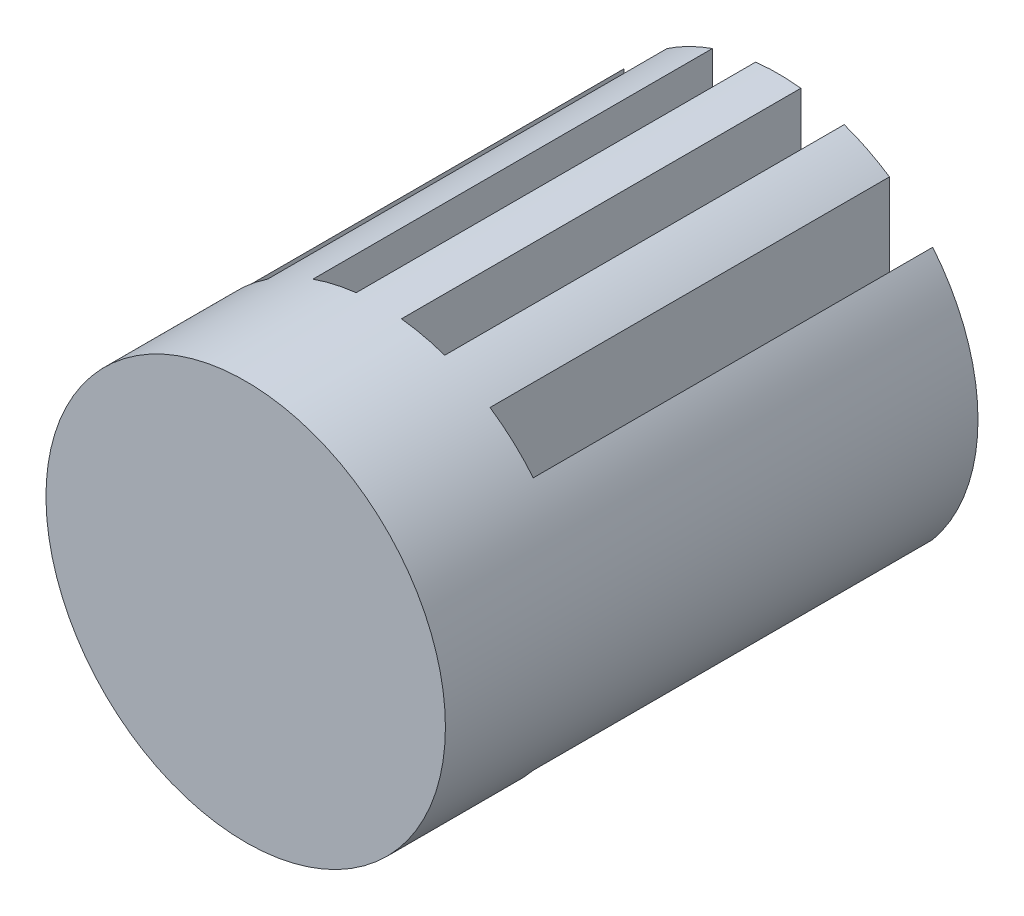
ISO-10303-21;
HEADER;
FILE_DESCRIPTION(('STEP AP214'),'2;1');
FILE_NAME('part.step','',(''),(''),'','','');
FILE_SCHEMA(('AUTOMOTIVE_DESIGN { 1 0 10303 214 1 1 1 1 }'));
ENDSEC;
DATA;
#1=APPLICATION_CONTEXT('core data for automotive mechanical design processes');
#2=APPLICATION_PROTOCOL_DEFINITION('international standard','automotive_design',2000,#1);
#3=PRODUCT_CONTEXT('',#1,'mechanical');
#4=PRODUCT('Part','Part','',(#3));
#5=PRODUCT_RELATED_PRODUCT_CATEGORY('part','',(#4));
#6=PRODUCT_DEFINITION_FORMATION('','',#4);
#7=PRODUCT_DEFINITION_CONTEXT('part definition',#1,'design');
#8=PRODUCT_DEFINITION('design','',#6,#7);
#9=PRODUCT_DEFINITION_SHAPE('','',#8);
#10=(LENGTH_UNIT() NAMED_UNIT(*) SI_UNIT(.MILLI.,.METRE.));
#11=(NAMED_UNIT(*) PLANE_ANGLE_UNIT() SI_UNIT($,.RADIAN.));
#12=(NAMED_UNIT(*) SI_UNIT($,.STERADIAN.) SOLID_ANGLE_UNIT());
#13=UNCERTAINTY_MEASURE_WITH_UNIT(LENGTH_MEASURE(1.E-05),#10,'distance_accuracy_value','');
#14=(GEOMETRIC_REPRESENTATION_CONTEXT(3) GLOBAL_UNCERTAINTY_ASSIGNED_CONTEXT((#13)) GLOBAL_UNIT_ASSIGNED_CONTEXT((#10,
#11,#12)) REPRESENTATION_CONTEXT('',''));
#15=CARTESIAN_POINT('',(0.,0.,0.));
#16=DIRECTION('',(0.,0.,1.));
#17=DIRECTION('',(1.,0.,0.));
#18=AXIS2_PLACEMENT_3D('',#15,#16,#17);
#19=CARTESIAN_POINT('',(0.,0.,0.));
#20=DIRECTION('',(0.,0.,1.));
#21=DIRECTION('',(1.,0.,0.));
#22=AXIS2_PLACEMENT_3D('',#19,#20,#21);
#23=PLANE('',#22);
#24=CARTESIAN_POINT('',(0.,0.,0.));
#25=DIRECTION('',(0.,0.,1.));
#26=DIRECTION('',(1.,0.,0.));
#27=AXIS2_PLACEMENT_3D('',#24,#25,#26);
#28=CIRCLE('',#27,19.05);
#29=CARTESIAN_POINT('',(10.6045,15.8255198887746,0.));
#30=VERTEX_POINT('',#29);
#31=CARTESIAN_POINT('',(6.2865,17.982836754806,0.));
#32=VERTEX_POINT('',#31);
#33=EDGE_CURVE('E319',#30,#32,#28,.T.);
#34=ORIENTED_EDGE('',*,*,#33,.F.);
#35=DIRECTION('',(0.,1.,0.));
#36=VECTOR('',#35,1.);
#37=CARTESIAN_POINT('',(10.6045,19.05,0.));
#38=LINE('',#37,#36);
#39=CARTESIAN_POINT('',(10.6045,-15.8255198887746,0.));
#40=VERTEX_POINT('',#39);
#41=EDGE_CURVE('E269',#40,#30,#38,.T.);
#42=ORIENTED_EDGE('',*,*,#41,.F.);
#43=CARTESIAN_POINT('',(6.28649999999999,-17.982836754806,0.));
#44=VERTEX_POINT('',#43);
#45=EDGE_CURVE('E187',#44,#40,#28,.T.);
#46=ORIENTED_EDGE('',*,*,#45,.F.);
#47=DIRECTION('',(0.,-1.,0.));
#48=VECTOR('',#47,1.);
#49=CARTESIAN_POINT('',(6.2865,19.05,0.));
#50=LINE('',#49,#48);
#51=EDGE_CURVE('E278',#32,#44,#50,.T.);
#52=ORIENTED_EDGE('',*,*,#51,.F.);
#53=EDGE_LOOP('',(#34,#42,#46,#52));
#54=FACE_BOUND('',#53,.T.);
#55=ADVANCED_FACE('F39',(#54),#23,.F.);
#56=CARTESIAN_POINT('',(2.159,18.9272612651699,0.));
#57=VERTEX_POINT('',#56);
#58=CARTESIAN_POINT('',(-2.159,18.9272612651699,0.));
#59=VERTEX_POINT('',#58);
#60=EDGE_CURVE('E192',#57,#59,#28,.T.);
#61=ORIENTED_EDGE('',*,*,#60,.F.);
#62=DIRECTION('',(0.,1.,0.));
#63=VECTOR('',#62,1.);
#64=CARTESIAN_POINT('',(2.159,19.05,0.));
#65=LINE('',#64,#63);
#66=CARTESIAN_POINT('',(2.159,-18.9272612651699,0.));
#67=VERTEX_POINT('',#66);
#68=EDGE_CURVE('E281',#67,#57,#65,.T.);
#69=ORIENTED_EDGE('',*,*,#68,.F.);
#70=CARTESIAN_POINT('',(-2.159,-18.9272612651699,0.));
#71=VERTEX_POINT('',#70);
#72=EDGE_CURVE('E186',#71,#67,#28,.T.);
#73=ORIENTED_EDGE('',*,*,#72,.F.);
#74=DIRECTION('',(0.,1.,0.));
#75=VECTOR('',#74,1.);
#76=CARTESIAN_POINT('',(-2.159,0.,0.));
#77=LINE('',#76,#75);
#78=EDGE_CURVE('E198',#71,#59,#77,.T.);
#79=ORIENTED_EDGE('',*,*,#78,.T.);
#80=EDGE_LOOP('',(#61,#69,#73,#79));
#81=FACE_BOUND('',#80,.T.);
#82=ADVANCED_FACE('F345',(#81),#23,.F.);
#83=CARTESIAN_POINT('',(-10.6045,-15.8255198887746,0.));
#84=VERTEX_POINT('',#83);
#85=CARTESIAN_POINT('',(-6.2865,-17.982836754806,0.));
#86=VERTEX_POINT('',#85);
#87=EDGE_CURVE('E180',#84,#86,#28,.T.);
#88=ORIENTED_EDGE('',*,*,#87,.F.);
#89=DIRECTION('',(0.,1.,0.));
#90=VECTOR('',#89,1.);
#91=CARTESIAN_POINT('',(-10.6045,0.,0.));
#92=LINE('',#91,#90);
#93=CARTESIAN_POINT('',(-10.6045,15.8255198887746,0.));
#94=VERTEX_POINT('',#93);
#95=EDGE_CURVE('E164',#84,#94,#92,.T.);
#96=ORIENTED_EDGE('',*,*,#95,.T.);
#97=CARTESIAN_POINT('',(-6.2865,17.982836754806,0.));
#98=VERTEX_POINT('',#97);
#99=EDGE_CURVE('E179',#98,#94,#28,.T.);
#100=ORIENTED_EDGE('',*,*,#99,.F.);
#101=DIRECTION('',(0.,-1.,0.));
#102=VECTOR('',#101,1.);
#103=CARTESIAN_POINT('',(-6.2865,0.,0.));
#104=LINE('',#103,#102);
#105=EDGE_CURVE('E194',#98,#86,#104,.T.);
#106=ORIENTED_EDGE('',*,*,#105,.T.);
#107=EDGE_LOOP('',(#88,#96,#100,#106));
#108=FACE_BOUND('',#107,.T.);
#109=ADVANCED_FACE('F349',(#108),#23,.F.);
#110=CARTESIAN_POINT('',(14.732,-12.0776933228162,0.));
#111=VERTEX_POINT('',#110);
#112=CARTESIAN_POINT('',(14.732,12.0776933228162,0.));
#113=VERTEX_POINT('',#112);
#114=EDGE_CURVE('E323',#111,#113,#28,.T.);
#115=ORIENTED_EDGE('',*,*,#114,.F.);
#116=DIRECTION('',(0.,-1.,0.));
#117=VECTOR('',#116,1.);
#118=CARTESIAN_POINT('',(14.732,19.05,0.));
#119=LINE('',#118,#117);
#120=EDGE_CURVE('E265',#113,#111,#119,.T.);
#121=ORIENTED_EDGE('',*,*,#120,.F.);
#122=EDGE_LOOP('',(#115,#121));
#123=FACE_BOUND('',#122,.T.);
#124=ADVANCED_FACE('F355',(#123),#23,.F.);
#125=CARTESIAN_POINT('',(0.,0.,50.8));
#126=DIRECTION('',(0.,0.,-1.));
#127=DIRECTION('',(-1.,0.,0.));
#128=AXIS2_PLACEMENT_3D('',#125,#126,#127);
#129=CYLINDRICAL_SURFACE('',#128,19.05);
#130=CARTESIAN_POINT('',(0.,0.,38.1));
#131=DIRECTION('',(0.,0.,1.));
#132=DIRECTION('',(1.,0.,0.));
#133=AXIS2_PLACEMENT_3D('',#130,#131,#132);
#134=CIRCLE('',#133,19.05);
#135=CARTESIAN_POINT('',(14.732,12.0776933228162,38.1));
#136=VERTEX_POINT('',#135);
#137=CARTESIAN_POINT('',(10.6045,15.8255198887746,38.1));
#138=VERTEX_POINT('',#137);
#139=EDGE_CURVE('E237',#136,#138,#134,.T.);
#140=ORIENTED_EDGE('',*,*,#139,.T.);
#141=DIRECTION('',(0.,0.,-1.));
#142=VECTOR('',#141,1.);
#143=CARTESIAN_POINT('',(10.6045,15.8255198887746,50.8));
#144=LINE('',#143,#142);
#145=EDGE_CURVE('E11',#138,#30,#144,.T.);
#146=ORIENTED_EDGE('',*,*,#145,.T.);
#147=ORIENTED_EDGE('',*,*,#33,.T.);
#148=DIRECTION('',(0.,0.,-1.));
#149=VECTOR('',#148,1.);
#150=CARTESIAN_POINT('',(6.2865,17.982836754806,50.8));
#151=LINE('',#150,#149);
#152=CARTESIAN_POINT('',(6.2865,17.982836754806,38.1));
#153=VERTEX_POINT('',#152);
#154=EDGE_CURVE('E221',#32,#153,#151,.F.);
#155=ORIENTED_EDGE('',*,*,#154,.T.);
#156=CARTESIAN_POINT('',(0.,0.,38.1));
#157=DIRECTION('',(0.,0.,1.));
#158=DIRECTION('',(1.,0.,0.));
#159=AXIS2_PLACEMENT_3D('',#156,#157,#158);
#160=CIRCLE('',#159,19.05);
#161=CARTESIAN_POINT('',(2.159,18.9272612651699,38.1));
#162=VERTEX_POINT('',#161);
#163=EDGE_CURVE('E213',#153,#162,#160,.T.);
#164=ORIENTED_EDGE('',*,*,#163,.T.);
#165=DIRECTION('',(0.,0.,-1.));
#166=VECTOR('',#165,1.);
#167=CARTESIAN_POINT('',(2.159,18.9272612651699,50.8));
#168=LINE('',#167,#166);
#169=EDGE_CURVE('E225',#162,#57,#168,.T.);
#170=ORIENTED_EDGE('',*,*,#169,.T.);
#171=ORIENTED_EDGE('',*,*,#60,.T.);
#172=DIRECTION('',(0.,0.,-1.));
#173=VECTOR('',#172,1.);
#174=CARTESIAN_POINT('',(-2.159,18.9272612651699,50.8));
#175=LINE('',#174,#173);
#176=CARTESIAN_POINT('',(-2.159,18.9272612651699,38.1));
#177=VERTEX_POINT('',#176);
#178=EDGE_CURVE('E310',#59,#177,#175,.F.);
#179=ORIENTED_EDGE('',*,*,#178,.T.);
#180=CARTESIAN_POINT('',(0.,0.,38.1));
#181=DIRECTION('',(0.,0.,-1.));
#182=DIRECTION('',(-1.,0.,0.));
#183=AXIS2_PLACEMENT_3D('',#180,#181,#182);
#184=CIRCLE('',#183,19.05);
#185=CARTESIAN_POINT('',(-6.2865,17.982836754806,38.1));
#186=VERTEX_POINT('',#185);
#187=EDGE_CURVE('E165',#186,#177,#184,.T.);
#188=ORIENTED_EDGE('',*,*,#187,.F.);
#189=DIRECTION('',(0.,0.,-1.));
#190=VECTOR('',#189,1.);
#191=CARTESIAN_POINT('',(-6.28649999999999,17.982836754806,50.8));
#192=LINE('',#191,#190);
#193=EDGE_CURVE('E306',#186,#98,#192,.T.);
#194=ORIENTED_EDGE('',*,*,#193,.T.);
#195=ORIENTED_EDGE('',*,*,#99,.T.);
#196=DIRECTION('',(0.,0.,-1.));
#197=VECTOR('',#196,1.);
#198=CARTESIAN_POINT('',(-10.6045,15.8255198887746,50.8));
#199=LINE('',#198,#197);
#200=CARTESIAN_POINT('',(-10.6045,15.8255198887746,38.1));
#201=VERTEX_POINT('',#200);
#202=EDGE_CURVE('E175',#94,#201,#199,.F.);
#203=ORIENTED_EDGE('',*,*,#202,.T.);
#204=CARTESIAN_POINT('',(0.,0.,38.1));
#205=DIRECTION('',(0.,0.,-1.));
#206=DIRECTION('',(-1.,0.,0.));
#207=AXIS2_PLACEMENT_3D('',#204,#205,#206);
#208=CIRCLE('',#207,19.05);
#209=CARTESIAN_POINT('',(-14.732,12.0776933228162,38.1));
#210=VERTEX_POINT('',#209);
#211=EDGE_CURVE('E173',#210,#201,#208,.T.);
#212=ORIENTED_EDGE('',*,*,#211,.F.);
#213=DIRECTION('',(0.,0.,-1.));
#214=VECTOR('',#213,1.);
#215=CARTESIAN_POINT('',(-14.732,12.0776933228163,50.8));
#216=LINE('',#215,#214);
#217=CARTESIAN_POINT('',(-14.732,12.0776933228162,0.));
#218=VERTEX_POINT('',#217);
#219=EDGE_CURVE('E156',#210,#218,#216,.T.);
#220=ORIENTED_EDGE('',*,*,#219,.T.);
#221=CARTESIAN_POINT('',(-14.732,-12.0776933228162,0.));
#222=VERTEX_POINT('',#221);
#223=EDGE_CURVE('E171',#218,#222,#28,.T.);
#224=ORIENTED_EDGE('',*,*,#223,.T.);
#225=DIRECTION('',(0.,0.,-1.));
#226=VECTOR('',#225,1.);
#227=CARTESIAN_POINT('',(-14.732,-12.0776933228162,50.8));
#228=LINE('',#227,#226);
#229=CARTESIAN_POINT('',(-14.732,-12.0776933228162,38.1));
#230=VERTEX_POINT('',#229);
#231=EDGE_CURVE('E159',#222,#230,#228,.F.);
#232=ORIENTED_EDGE('',*,*,#231,.T.);
#233=CARTESIAN_POINT('',(-10.6045,-15.8255198887746,38.1));
#234=VERTEX_POINT('',#233);
#235=EDGE_CURVE('E229',#234,#230,#208,.T.);
#236=ORIENTED_EDGE('',*,*,#235,.F.);
#237=DIRECTION('',(0.,0.,-1.));
#238=VECTOR('',#237,1.);
#239=CARTESIAN_POINT('',(-10.6045,-15.8255198887746,50.8));
#240=LINE('',#239,#238);
#241=EDGE_CURVE('E290',#234,#84,#240,.T.);
#242=ORIENTED_EDGE('',*,*,#241,.T.);
#243=ORIENTED_EDGE('',*,*,#87,.T.);
#244=DIRECTION('',(0.,0.,-1.));
#245=VECTOR('',#244,1.);
#246=CARTESIAN_POINT('',(-6.2865,-17.982836754806,50.8));
#247=LINE('',#246,#245);
#248=CARTESIAN_POINT('',(-6.2865,-17.982836754806,38.1));
#249=VERTEX_POINT('',#248);
#250=EDGE_CURVE('E302',#86,#249,#247,.F.);
#251=ORIENTED_EDGE('',*,*,#250,.T.);
#252=CARTESIAN_POINT('',(-2.159,-18.9272612651699,38.1));
#253=VERTEX_POINT('',#252);
#254=EDGE_CURVE('E202',#253,#249,#184,.T.);
#255=ORIENTED_EDGE('',*,*,#254,.F.);
#256=DIRECTION('',(0.,0.,-1.));
#257=VECTOR('',#256,1.);
#258=CARTESIAN_POINT('',(-2.159,-18.9272612651699,50.8));
#259=LINE('',#258,#257);
#260=EDGE_CURVE('E313',#253,#71,#259,.T.);
#261=ORIENTED_EDGE('',*,*,#260,.T.);
#262=ORIENTED_EDGE('',*,*,#72,.T.);
#263=DIRECTION('',(0.,0.,-1.));
#264=VECTOR('',#263,1.);
#265=CARTESIAN_POINT('',(2.159,-18.9272612651699,50.8));
#266=LINE('',#265,#264);
#267=CARTESIAN_POINT('',(2.159,-18.9272612651699,38.1));
#268=VERTEX_POINT('',#267);
#269=EDGE_CURVE('E217',#67,#268,#266,.F.);
#270=ORIENTED_EDGE('',*,*,#269,.T.);
#271=CARTESIAN_POINT('',(6.28649999999999,-17.982836754806,38.1));
#272=VERTEX_POINT('',#271);
#273=EDGE_CURVE('E208',#268,#272,#160,.T.);
#274=ORIENTED_EDGE('',*,*,#273,.T.);
#275=DIRECTION('',(0.,0.,-1.));
#276=VECTOR('',#275,1.);
#277=CARTESIAN_POINT('',(6.28649999999999,-17.982836754806,50.8));
#278=LINE('',#277,#276);
#279=EDGE_CURVE('E212',#272,#44,#278,.T.);
#280=ORIENTED_EDGE('',*,*,#279,.T.);
#281=ORIENTED_EDGE('',*,*,#45,.T.);
#282=DIRECTION('',(0.,0.,-1.));
#283=VECTOR('',#282,1.);
#284=CARTESIAN_POINT('',(10.6045,-15.8255198887746,50.8));
#285=LINE('',#284,#283);
#286=CARTESIAN_POINT('',(10.6045,-15.8255198887746,38.1));
#287=VERTEX_POINT('',#286);
#288=EDGE_CURVE('E241',#40,#287,#285,.F.);
#289=ORIENTED_EDGE('',*,*,#288,.T.);
#290=CARTESIAN_POINT('',(14.732,-12.0776933228162,38.1));
#291=VERTEX_POINT('',#290);
#292=EDGE_CURVE('E232',#287,#291,#134,.T.);
#293=ORIENTED_EDGE('',*,*,#292,.T.);
#294=DIRECTION('',(0.,0.,-1.));
#295=VECTOR('',#294,1.);
#296=CARTESIAN_POINT('',(14.732,-12.0776933228162,50.8));
#297=LINE('',#296,#295);
#298=EDGE_CURVE('E236',#291,#111,#297,.T.);
#299=ORIENTED_EDGE('',*,*,#298,.T.);
#300=ORIENTED_EDGE('',*,*,#114,.T.);
#301=DIRECTION('',(0.,0.,-1.));
#302=VECTOR('',#301,1.);
#303=CARTESIAN_POINT('',(14.732,12.0776933228162,50.8));
#304=LINE('',#303,#302);
#305=EDGE_CURVE('E48',#113,#136,#304,.F.);
#306=ORIENTED_EDGE('',*,*,#305,.T.);
#307=EDGE_LOOP('',(#140,#146,#147,#155,#164,#170,#171,#179,#188,#194,#195,#203,#212,#220,#224,
#232,#236,#242,#243,#251,#255,#261,#262,#270,#274,#280,#281,#289,#293,#299,#300,#306));
#308=FACE_BOUND('',#307,.T.);
#309=CARTESIAN_POINT('',(0.,0.,50.8));
#310=DIRECTION('',(0.,0.,1.));
#311=DIRECTION('',(1.,0.,0.));
#312=AXIS2_PLACEMENT_3D('',#309,#310,#311);
#313=CIRCLE('',#312,19.05);
#314=CARTESIAN_POINT('',(19.05,0.,50.8));
#315=VERTEX_POINT('',#314);
#316=EDGE_CURVE('E185',#315,#315,#313,.T.);
#317=ORIENTED_EDGE('',*,*,#316,.F.);
#318=EDGE_LOOP('',(#317));
#319=FACE_BOUND('',#318,.T.);
#320=ADVANCED_FACE('F41',(#308,#319),#129,.T.);
#321=CARTESIAN_POINT('',(0.,0.,50.8));
#322=DIRECTION('',(0.,0.,1.));
#323=DIRECTION('',(1.,0.,0.));
#324=AXIS2_PLACEMENT_3D('',#321,#322,#323);
#325=PLANE('',#324);
#326=ORIENTED_EDGE('',*,*,#316,.T.);
#327=EDGE_LOOP('',(#326));
#328=FACE_BOUND('',#327,.T.);
#329=ADVANCED_FACE('F354',(#328),#325,.T.);
#330=ORIENTED_EDGE('',*,*,#223,.F.);
#331=DIRECTION('',(0.,-1.,0.));
#332=VECTOR('',#331,1.);
#333=CARTESIAN_POINT('',(-14.732,0.,0.));
#334=LINE('',#333,#332);
#335=EDGE_CURVE('E152',#218,#222,#334,.T.);
#336=ORIENTED_EDGE('',*,*,#335,.T.);
#337=EDGE_LOOP('',(#330,#336));
#338=FACE_BOUND('',#337,.T.);
#339=ADVANCED_FACE('F177',(#338),#23,.F.);
#340=CARTESIAN_POINT('',(0.,0.,38.1));
#341=DIRECTION('',(0.,0.,-1.));
#342=DIRECTION('',(-1.,0.,0.));
#343=AXIS2_PLACEMENT_3D('',#340,#341,#342);
#344=PLANE('',#343);
#345=ORIENTED_EDGE('',*,*,#187,.T.);
#346=DIRECTION('',(0.,-1.,0.));
#347=VECTOR('',#346,1.);
#348=CARTESIAN_POINT('',(-2.159,19.05,38.1));
#349=LINE('',#348,#347);
#350=EDGE_CURVE('E294',#177,#253,#349,.T.);
#351=ORIENTED_EDGE('',*,*,#350,.T.);
#352=ORIENTED_EDGE('',*,*,#254,.T.);
#353=DIRECTION('',(0.,1.,0.));
#354=VECTOR('',#353,1.);
#355=CARTESIAN_POINT('',(-6.2865,19.05,38.1));
#356=LINE('',#355,#354);
#357=EDGE_CURVE('E298',#249,#186,#356,.T.);
#358=ORIENTED_EDGE('',*,*,#357,.T.);
#359=EDGE_LOOP('',(#345,#351,#352,#358));
#360=FACE_BOUND('',#359,.T.);
#361=ADVANCED_FACE('F353',(#360),#344,.T.);
#362=CARTESIAN_POINT('',(-2.159,19.05,38.1));
#363=DIRECTION('',(1.,0.,0.));
#364=DIRECTION('',(0.,1.,0.));
#365=AXIS2_PLACEMENT_3D('',#362,#363,#364);
#366=PLANE('',#365);
#367=ORIENTED_EDGE('',*,*,#350,.F.);
#368=ORIENTED_EDGE('',*,*,#178,.F.);
#369=ORIENTED_EDGE('',*,*,#78,.F.);
#370=ORIENTED_EDGE('',*,*,#260,.F.);
#371=EDGE_LOOP('',(#367,#368,#369,#370));
#372=FACE_BOUND('',#371,.T.);
#373=ADVANCED_FACE('F360',(#372),#366,.F.);
#374=CARTESIAN_POINT('',(-6.2865,19.05,38.1));
#375=DIRECTION('',(-1.,0.,0.));
#376=DIRECTION('',(0.,-1.,0.));
#377=AXIS2_PLACEMENT_3D('',#374,#375,#376);
#378=PLANE('',#377);
#379=ORIENTED_EDGE('',*,*,#357,.F.);
#380=ORIENTED_EDGE('',*,*,#250,.F.);
#381=ORIENTED_EDGE('',*,*,#105,.F.);
#382=ORIENTED_EDGE('',*,*,#193,.F.);
#383=EDGE_LOOP('',(#379,#380,#381,#382));
#384=FACE_BOUND('',#383,.T.);
#385=ADVANCED_FACE('F379',(#384),#378,.F.);
#386=CARTESIAN_POINT('',(0.,0.,38.1));
#387=DIRECTION('',(0.,0.,-1.));
#388=DIRECTION('',(-1.,0.,0.));
#389=AXIS2_PLACEMENT_3D('',#386,#387,#388);
#390=PLANE('',#389);
#391=ORIENTED_EDGE('',*,*,#211,.T.);
#392=DIRECTION('',(0.,-1.,0.));
#393=VECTOR('',#392,1.);
#394=CARTESIAN_POINT('',(-10.6045,19.05,38.1));
#395=LINE('',#394,#393);
#396=EDGE_CURVE('E258',#201,#234,#395,.T.);
#397=ORIENTED_EDGE('',*,*,#396,.T.);
#398=ORIENTED_EDGE('',*,*,#235,.T.);
#399=DIRECTION('',(0.,1.,0.));
#400=VECTOR('',#399,1.);
#401=CARTESIAN_POINT('',(-14.732,19.05,38.1));
#402=LINE('',#401,#400);
#403=EDGE_CURVE('E263',#230,#210,#402,.T.);
#404=ORIENTED_EDGE('',*,*,#403,.T.);
#405=EDGE_LOOP('',(#391,#397,#398,#404));
#406=FACE_BOUND('',#405,.T.);
#407=ADVANCED_FACE('F391',(#406),#390,.T.);
#408=CARTESIAN_POINT('',(-10.6045,19.05,38.1));
#409=DIRECTION('',(1.,0.,0.));
#410=DIRECTION('',(0.,1.,0.));
#411=AXIS2_PLACEMENT_3D('',#408,#409,#410);
#412=PLANE('',#411);
#413=ORIENTED_EDGE('',*,*,#396,.F.);
#414=ORIENTED_EDGE('',*,*,#202,.F.);
#415=ORIENTED_EDGE('',*,*,#95,.F.);
#416=ORIENTED_EDGE('',*,*,#241,.F.);
#417=EDGE_LOOP('',(#413,#414,#415,#416));
#418=FACE_BOUND('',#417,.T.);
#419=ADVANCED_FACE('F393',(#418),#412,.F.);
#420=CARTESIAN_POINT('',(-14.732,19.05,38.1));
#421=DIRECTION('',(-1.,0.,0.));
#422=DIRECTION('',(0.,-1.,0.));
#423=AXIS2_PLACEMENT_3D('',#420,#421,#422);
#424=PLANE('',#423);
#425=ORIENTED_EDGE('',*,*,#403,.F.);
#426=ORIENTED_EDGE('',*,*,#231,.F.);
#427=ORIENTED_EDGE('',*,*,#335,.F.);
#428=ORIENTED_EDGE('',*,*,#219,.F.);
#429=EDGE_LOOP('',(#425,#426,#427,#428));
#430=FACE_BOUND('',#429,.T.);
#431=ADVANCED_FACE('F155',(#430),#424,.F.);
#432=CARTESIAN_POINT('',(2.159,19.05,38.1));
#433=DIRECTION('',(-1.,0.,0.));
#434=DIRECTION('',(0.,0.,1.));
#435=AXIS2_PLACEMENT_3D('',#432,#433,#434);
#436=PLANE('',#435);
#437=DIRECTION('',(0.,1.,0.));
#438=VECTOR('',#437,1.);
#439=CARTESIAN_POINT('',(2.159,19.05,38.1));
#440=LINE('',#439,#438);
#441=EDGE_CURVE('E274',#268,#162,#440,.T.);
#442=ORIENTED_EDGE('',*,*,#441,.F.);
#443=ORIENTED_EDGE('',*,*,#269,.F.);
#444=ORIENTED_EDGE('',*,*,#68,.T.);
#445=ORIENTED_EDGE('',*,*,#169,.F.);
#446=EDGE_LOOP('',(#442,#443,#444,#445));
#447=FACE_BOUND('',#446,.T.);
#448=ADVANCED_FACE('F400',(#447),#436,.F.);
#449=CARTESIAN_POINT('',(6.2865,19.05,38.1));
#450=DIRECTION('',(1.,0.,0.));
#451=DIRECTION('',(0.,1.,0.));
#452=AXIS2_PLACEMENT_3D('',#449,#450,#451);
#453=PLANE('',#452);
#454=DIRECTION('',(0.,-1.,0.));
#455=VECTOR('',#454,1.);
#456=CARTESIAN_POINT('',(6.2865,19.05,38.1));
#457=LINE('',#456,#455);
#458=EDGE_CURVE('E63',#153,#272,#457,.T.);
#459=ORIENTED_EDGE('',*,*,#458,.F.);
#460=ORIENTED_EDGE('',*,*,#154,.F.);
#461=ORIENTED_EDGE('',*,*,#51,.T.);
#462=ORIENTED_EDGE('',*,*,#279,.F.);
#463=EDGE_LOOP('',(#459,#460,#461,#462));
#464=FACE_BOUND('',#463,.T.);
#465=ADVANCED_FACE('F342',(#464),#453,.F.);
#466=CARTESIAN_POINT('',(0.,0.,38.1));
#467=DIRECTION('',(0.,0.,1.));
#468=DIRECTION('',(1.,0.,0.));
#469=AXIS2_PLACEMENT_3D('',#466,#467,#468);
#470=PLANE('',#469);
#471=ORIENTED_EDGE('',*,*,#458,.T.);
#472=ORIENTED_EDGE('',*,*,#273,.F.);
#473=ORIENTED_EDGE('',*,*,#441,.T.);
#474=ORIENTED_EDGE('',*,*,#163,.F.);
#475=EDGE_LOOP('',(#471,#472,#473,#474));
#476=FACE_BOUND('',#475,.T.);
#477=ADVANCED_FACE('F335',(#476),#470,.F.);
#478=CARTESIAN_POINT('',(10.6045,19.05,38.1));
#479=DIRECTION('',(-1.,0.,0.));
#480=DIRECTION('',(0.,-1.,0.));
#481=AXIS2_PLACEMENT_3D('',#478,#479,#480);
#482=PLANE('',#481);
#483=DIRECTION('',(0.,1.,0.));
#484=VECTOR('',#483,1.);
#485=CARTESIAN_POINT('',(10.6045,19.05,38.1));
#486=LINE('',#485,#484);
#487=EDGE_CURVE('E253',#287,#138,#486,.T.);
#488=ORIENTED_EDGE('',*,*,#487,.F.);
#489=ORIENTED_EDGE('',*,*,#288,.F.);
#490=ORIENTED_EDGE('',*,*,#41,.T.);
#491=ORIENTED_EDGE('',*,*,#145,.F.);
#492=EDGE_LOOP('',(#488,#489,#490,#491));
#493=FACE_BOUND('',#492,.T.);
#494=ADVANCED_FACE('F333',(#493),#482,.F.);
#495=CARTESIAN_POINT('',(14.732,19.05,38.1));
#496=DIRECTION('',(1.,0.,0.));
#497=DIRECTION('',(0.,1.,0.));
#498=AXIS2_PLACEMENT_3D('',#495,#496,#497);
#499=PLANE('',#498);
#500=DIRECTION('',(0.,-1.,0.));
#501=VECTOR('',#500,1.);
#502=CARTESIAN_POINT('',(14.732,19.05,38.1));
#503=LINE('',#502,#501);
#504=EDGE_CURVE('E55',#136,#291,#503,.T.);
#505=ORIENTED_EDGE('',*,*,#504,.F.);
#506=ORIENTED_EDGE('',*,*,#305,.F.);
#507=ORIENTED_EDGE('',*,*,#120,.T.);
#508=ORIENTED_EDGE('',*,*,#298,.F.);
#509=EDGE_LOOP('',(#505,#506,#507,#508));
#510=FACE_BOUND('',#509,.T.);
#511=ADVANCED_FACE('F255',(#510),#499,.F.);
#512=CARTESIAN_POINT('',(0.,0.,38.1));
#513=DIRECTION('',(0.,0.,1.));
#514=DIRECTION('',(1.,0.,0.));
#515=AXIS2_PLACEMENT_3D('',#512,#513,#514);
#516=PLANE('',#515);
#517=ORIENTED_EDGE('',*,*,#504,.T.);
#518=ORIENTED_EDGE('',*,*,#292,.F.);
#519=ORIENTED_EDGE('',*,*,#487,.T.);
#520=ORIENTED_EDGE('',*,*,#139,.F.);
#521=EDGE_LOOP('',(#517,#518,#519,#520));
#522=FACE_BOUND('',#521,.T.);
#523=ADVANCED_FACE('F251',(#522),#516,.F.);
#524=CLOSED_SHELL('',(#55,#82,#109,#124,#320,#329,#339,#361,#373,#385,#407,#419,#431,#448,#465,
#477,#494,#511,#523));
#525=MANIFOLD_SOLID_BREP('B2',#524);
#526=ADVANCED_BREP_SHAPE_REPRESENTATION('',(#18,#525),#14);
#527=SHAPE_DEFINITION_REPRESENTATION(#9,#526);
ENDSEC;
END-ISO-10303-21;
